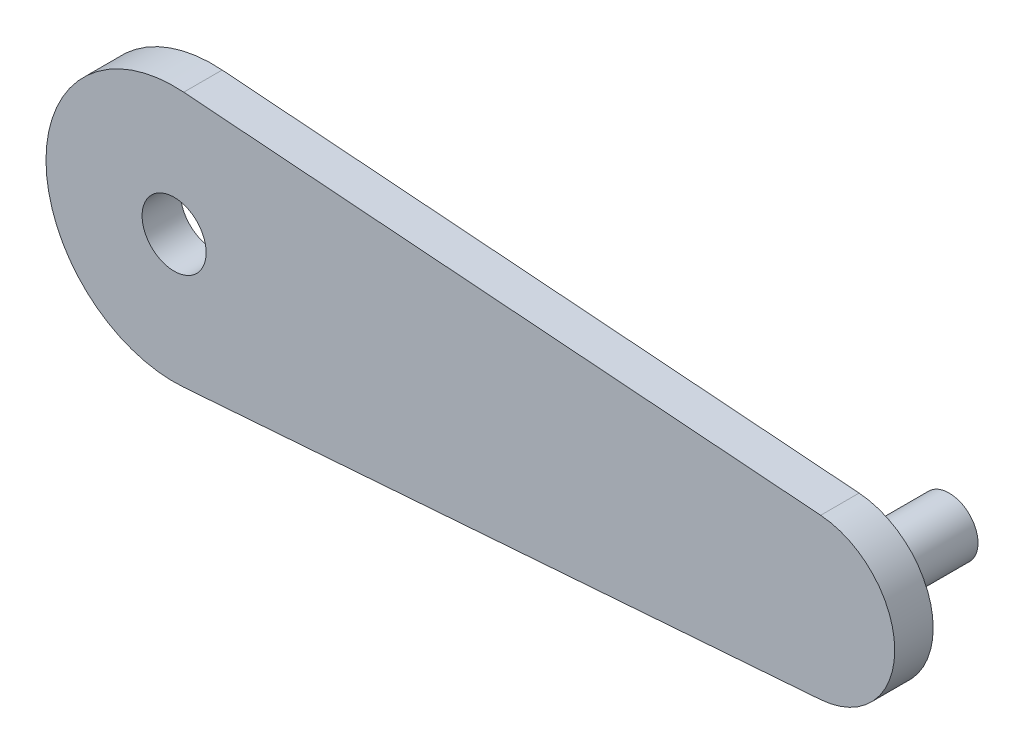
ISO-10303-21;
HEADER;
FILE_DESCRIPTION(('STEP AP214'),'2;1');
FILE_NAME('part.step','',(''),(''),'','','');
FILE_SCHEMA(('AUTOMOTIVE_DESIGN { 1 0 10303 214 1 1 1 1 }'));
ENDSEC;
DATA;
#1=APPLICATION_CONTEXT('core data for automotive mechanical design processes');
#2=APPLICATION_PROTOCOL_DEFINITION('international standard','automotive_design',2000,#1);
#3=PRODUCT_CONTEXT('',#1,'mechanical');
#4=PRODUCT('Part','Part','',(#3));
#5=PRODUCT_RELATED_PRODUCT_CATEGORY('part','',(#4));
#6=PRODUCT_DEFINITION_FORMATION('','',#4);
#7=PRODUCT_DEFINITION_CONTEXT('part definition',#1,'design');
#8=PRODUCT_DEFINITION('design','',#6,#7);
#9=PRODUCT_DEFINITION_SHAPE('','',#8);
#10=(LENGTH_UNIT() NAMED_UNIT(*) SI_UNIT(.MILLI.,.METRE.));
#11=(NAMED_UNIT(*) PLANE_ANGLE_UNIT() SI_UNIT($,.RADIAN.));
#12=(NAMED_UNIT(*) SI_UNIT($,.STERADIAN.) SOLID_ANGLE_UNIT());
#13=UNCERTAINTY_MEASURE_WITH_UNIT(LENGTH_MEASURE(1.E-05),#10,'distance_accuracy_value','');
#14=(GEOMETRIC_REPRESENTATION_CONTEXT(3) GLOBAL_UNCERTAINTY_ASSIGNED_CONTEXT((#13)) GLOBAL_UNIT_ASSIGNED_CONTEXT((#10,
#11,#12)) REPRESENTATION_CONTEXT('',''));
#15=CARTESIAN_POINT('',(0.,0.,0.));
#16=DIRECTION('',(0.,0.,1.));
#17=DIRECTION('',(1.,0.,0.));
#18=AXIS2_PLACEMENT_3D('',#15,#16,#17);
#19=CARTESIAN_POINT('',(0.,0.,1.2));
#20=DIRECTION('',(0.,0.,1.));
#21=DIRECTION('',(1.,0.,0.));
#22=AXIS2_PLACEMENT_3D('',#19,#20,#21);
#23=PLANE('',#22);
#24=DIRECTION('',(0.997183533758957,-0.0750000000000001,0.));
#25=VECTOR('',#24,1.);
#26=CARTESIAN_POINT('',(0.3,3.98873413503583,1.2));
#27=LINE('',#26,#25);
#28=CARTESIAN_POINT('',(0.3,3.98873413503583,1.2));
#29=VERTEX_POINT('',#28);
#30=CARTESIAN_POINT('',(20.1875,2.49295883439739,1.2));
#31=VERTEX_POINT('',#30);
#32=EDGE_CURVE('E106',#29,#31,#27,.T.);
#33=ORIENTED_EDGE('',*,*,#32,.F.);
#34=CARTESIAN_POINT('',(0.,0.,1.2));
#35=DIRECTION('',(0.,0.,1.));
#36=DIRECTION('',(1.,0.,0.));
#37=AXIS2_PLACEMENT_3D('',#34,#35,#36);
#38=CIRCLE('',#37,4.);
#39=CARTESIAN_POINT('',(0.3,-3.98873413503582,1.2));
#40=VERTEX_POINT('',#39);
#41=EDGE_CURVE('E100',#29,#40,#38,.T.);
#42=ORIENTED_EDGE('',*,*,#41,.T.);
#43=DIRECTION('',(-0.997183533758957,-0.075,0.));
#44=VECTOR('',#43,1.);
#45=CARTESIAN_POINT('',(0.3,-3.98873413503582,1.2));
#46=LINE('',#45,#44);
#47=CARTESIAN_POINT('',(20.1875,-2.49295883439739,1.2));
#48=VERTEX_POINT('',#47);
#49=EDGE_CURVE('E105',#48,#40,#46,.T.);
#50=ORIENTED_EDGE('',*,*,#49,.F.);
#51=CARTESIAN_POINT('',(20.,0.,1.2));
#52=DIRECTION('',(0.,0.,1.));
#53=DIRECTION('',(1.,0.,0.));
#54=AXIS2_PLACEMENT_3D('',#51,#52,#53);
#55=CIRCLE('',#54,2.5);
#56=EDGE_CURVE('E119',#31,#48,#55,.F.);
#57=ORIENTED_EDGE('',*,*,#56,.F.);
#58=EDGE_LOOP('',(#33,#42,#50,#57));
#59=FACE_BOUND('',#58,.T.);
#60=CARTESIAN_POINT('',(0.,0.,1.2));
#61=DIRECTION('',(0.,0.,1.));
#62=DIRECTION('',(1.,0.,0.));
#63=AXIS2_PLACEMENT_3D('',#60,#61,#62);
#64=CIRCLE('',#63,1.);
#65=CARTESIAN_POINT('',(1.,0.,1.2));
#66=VERTEX_POINT('',#65);
#67=EDGE_CURVE('E128',#66,#66,#64,.T.);
#68=ORIENTED_EDGE('',*,*,#67,.F.);
#69=EDGE_LOOP('',(#68));
#70=FACE_BOUND('',#69,.T.);
#71=ADVANCED_FACE('F56',(#59,#70),#23,.T.);
#72=CARTESIAN_POINT('',(0.,0.,0.));
#73=DIRECTION('',(0.,0.,1.));
#74=DIRECTION('',(1.,0.,0.));
#75=AXIS2_PLACEMENT_3D('',#72,#73,#74);
#76=PLANE('',#75);
#77=CARTESIAN_POINT('',(20.,0.,0.));
#78=DIRECTION('',(0.,0.,1.));
#79=DIRECTION('',(1.,0.,0.));
#80=AXIS2_PLACEMENT_3D('',#77,#78,#79);
#81=CIRCLE('',#80,0.9);
#82=CARTESIAN_POINT('',(20.9,0.,0.));
#83=VERTEX_POINT('',#82);
#84=EDGE_CURVE('E152',#83,#83,#81,.T.);
#85=ORIENTED_EDGE('',*,*,#84,.T.);
#86=EDGE_LOOP('',(#85));
#87=FACE_BOUND('',#86,.T.);
#88=DIRECTION('',(0.997183533758957,-0.0750000000000001,0.));
#89=VECTOR('',#88,1.);
#90=CARTESIAN_POINT('',(0.3,3.98873413503583,0.));
#91=LINE('',#90,#89);
#92=CARTESIAN_POINT('',(0.3,3.98873413503583,0.));
#93=VERTEX_POINT('',#92);
#94=CARTESIAN_POINT('',(20.1875,2.49295883439739,0.));
#95=VERTEX_POINT('',#94);
#96=EDGE_CURVE('E125',#93,#95,#91,.T.);
#97=ORIENTED_EDGE('',*,*,#96,.T.);
#98=CARTESIAN_POINT('',(20.,0.,0.));
#99=DIRECTION('',(0.,0.,1.));
#100=DIRECTION('',(1.,0.,0.));
#101=AXIS2_PLACEMENT_3D('',#98,#99,#100);
#102=CIRCLE('',#101,2.5);
#103=CARTESIAN_POINT('',(20.1875,-2.49295883439739,0.));
#104=VERTEX_POINT('',#103);
#105=EDGE_CURVE('E134',#95,#104,#102,.F.);
#106=ORIENTED_EDGE('',*,*,#105,.T.);
#107=DIRECTION('',(-0.997183533758957,-0.075,0.));
#108=VECTOR('',#107,1.);
#109=CARTESIAN_POINT('',(0.3,-3.98873413503582,0.));
#110=LINE('',#109,#108);
#111=CARTESIAN_POINT('',(0.3,-3.98873413503582,0.));
#112=VERTEX_POINT('',#111);
#113=EDGE_CURVE('E131',#104,#112,#110,.T.);
#114=ORIENTED_EDGE('',*,*,#113,.T.);
#115=CARTESIAN_POINT('',(0.,0.,0.));
#116=DIRECTION('',(0.,0.,1.));
#117=DIRECTION('',(1.,0.,0.));
#118=AXIS2_PLACEMENT_3D('',#115,#116,#117);
#119=CIRCLE('',#118,4.);
#120=EDGE_CURVE('E113',#93,#112,#119,.T.);
#121=ORIENTED_EDGE('',*,*,#120,.F.);
#122=EDGE_LOOP('',(#97,#106,#114,#121));
#123=FACE_BOUND('',#122,.T.);
#124=CARTESIAN_POINT('',(0.,0.,0.));
#125=DIRECTION('',(0.,0.,1.));
#126=DIRECTION('',(1.,0.,0.));
#127=AXIS2_PLACEMENT_3D('',#124,#125,#126);
#128=CIRCLE('',#127,1.);
#129=CARTESIAN_POINT('',(1.,0.,0.));
#130=VERTEX_POINT('',#129);
#131=EDGE_CURVE('E144',#130,#130,#128,.T.);
#132=ORIENTED_EDGE('',*,*,#131,.T.);
#133=EDGE_LOOP('',(#132));
#134=FACE_BOUND('',#133,.T.);
#135=ADVANCED_FACE('F172',(#87,#123,#134),#76,.F.);
#136=CARTESIAN_POINT('',(0.3,3.98873413503583,1.2));
#137=DIRECTION('',(0.0750000000000001,0.997183533758956,0.));
#138=DIRECTION('',(-0.997183533758957,0.0750000000000001,0.));
#139=AXIS2_PLACEMENT_3D('',#136,#137,#138);
#140=PLANE('',#139);
#141=ORIENTED_EDGE('',*,*,#96,.F.);
#142=DIRECTION('',(0.,0.,-1.));
#143=VECTOR('',#142,1.);
#144=CARTESIAN_POINT('',(0.3,3.98873413503583,1.2));
#145=LINE('',#144,#143);
#146=EDGE_CURVE('E12',#29,#93,#145,.T.);
#147=ORIENTED_EDGE('',*,*,#146,.F.);
#148=ORIENTED_EDGE('',*,*,#32,.T.);
#149=DIRECTION('',(0.,0.,-1.));
#150=VECTOR('',#149,1.);
#151=CARTESIAN_POINT('',(20.1875,2.49295883439739,1.2));
#152=LINE('',#151,#150);
#153=EDGE_CURVE('E74',#31,#95,#152,.T.);
#154=ORIENTED_EDGE('',*,*,#153,.T.);
#155=EDGE_LOOP('',(#141,#147,#148,#154));
#156=FACE_BOUND('',#155,.T.);
#157=ADVANCED_FACE('F58',(#156),#140,.T.);
#158=CARTESIAN_POINT('',(0.,0.,1.2));
#159=DIRECTION('',(0.,0.,-1.));
#160=DIRECTION('',(-1.,0.,0.));
#161=AXIS2_PLACEMENT_3D('',#158,#159,#160);
#162=CYLINDRICAL_SURFACE('',#161,4.);
#163=ORIENTED_EDGE('',*,*,#120,.T.);
#164=DIRECTION('',(0.,0.,-1.));
#165=VECTOR('',#164,1.);
#166=CARTESIAN_POINT('',(0.3,-3.98873413503582,1.2));
#167=LINE('',#166,#165);
#168=EDGE_CURVE('E66',#40,#112,#167,.T.);
#169=ORIENTED_EDGE('',*,*,#168,.F.);
#170=ORIENTED_EDGE('',*,*,#41,.F.);
#171=ORIENTED_EDGE('',*,*,#146,.T.);
#172=EDGE_LOOP('',(#163,#169,#170,#171));
#173=FACE_BOUND('',#172,.T.);
#174=ADVANCED_FACE('F111',(#173),#162,.T.);
#175=CARTESIAN_POINT('',(0.3,-3.98873413503582,1.2));
#176=DIRECTION('',(0.075,-0.997183533758956,0.));
#177=DIRECTION('',(0.997183533758957,0.075,0.));
#178=AXIS2_PLACEMENT_3D('',#175,#176,#177);
#179=PLANE('',#178);
#180=ORIENTED_EDGE('',*,*,#113,.F.);
#181=DIRECTION('',(0.,0.,-1.));
#182=VECTOR('',#181,1.);
#183=CARTESIAN_POINT('',(20.1875,-2.49295883439739,1.2));
#184=LINE('',#183,#182);
#185=EDGE_CURVE('E87',#48,#104,#184,.T.);
#186=ORIENTED_EDGE('',*,*,#185,.F.);
#187=ORIENTED_EDGE('',*,*,#49,.T.);
#188=ORIENTED_EDGE('',*,*,#168,.T.);
#189=EDGE_LOOP('',(#180,#186,#187,#188));
#190=FACE_BOUND('',#189,.T.);
#191=ADVANCED_FACE('F117',(#190),#179,.T.);
#192=CARTESIAN_POINT('',(20.,0.,1.2));
#193=DIRECTION('',(0.,0.,-1.));
#194=DIRECTION('',(-1.,0.,0.));
#195=AXIS2_PLACEMENT_3D('',#192,#193,#194);
#196=CYLINDRICAL_SURFACE('',#195,2.5);
#197=ORIENTED_EDGE('',*,*,#105,.F.);
#198=ORIENTED_EDGE('',*,*,#153,.F.);
#199=ORIENTED_EDGE('',*,*,#56,.T.);
#200=ORIENTED_EDGE('',*,*,#185,.T.);
#201=EDGE_LOOP('',(#197,#198,#199,#200));
#202=FACE_BOUND('',#201,.T.);
#203=ADVANCED_FACE('F181',(#202),#196,.T.);
#204=CARTESIAN_POINT('',(0.,0.,1.2));
#205=DIRECTION('',(0.,0.,-1.));
#206=DIRECTION('',(-1.,0.,0.));
#207=AXIS2_PLACEMENT_3D('',#204,#205,#206);
#208=CYLINDRICAL_SURFACE('',#207,1.);
#209=ORIENTED_EDGE('',*,*,#67,.T.);
#210=EDGE_LOOP('',(#209));
#211=FACE_BOUND('',#210,.T.);
#212=ORIENTED_EDGE('',*,*,#131,.F.);
#213=EDGE_LOOP('',(#212));
#214=FACE_BOUND('',#213,.T.);
#215=ADVANCED_FACE('F169',(#211,#214),#208,.F.);
#216=CARTESIAN_POINT('',(20.,0.,-3.));
#217=DIRECTION('',(0.,0.,1.));
#218=DIRECTION('',(1.,0.,0.));
#219=AXIS2_PLACEMENT_3D('',#216,#217,#218);
#220=CYLINDRICAL_SURFACE('',#219,0.9);
#221=CARTESIAN_POINT('',(20.,0.,-3.));
#222=DIRECTION('',(0.,0.,1.));
#223=DIRECTION('',(1.,0.,0.));
#224=AXIS2_PLACEMENT_3D('',#221,#222,#223);
#225=CIRCLE('',#224,0.9);
#226=CARTESIAN_POINT('',(20.9,0.,-3.));
#227=VERTEX_POINT('',#226);
#228=EDGE_CURVE('E148',#227,#227,#225,.T.);
#229=ORIENTED_EDGE('',*,*,#228,.T.);
#230=EDGE_LOOP('',(#229));
#231=FACE_BOUND('',#230,.T.);
#232=ORIENTED_EDGE('',*,*,#84,.F.);
#233=EDGE_LOOP('',(#232));
#234=FACE_BOUND('',#233,.T.);
#235=ADVANCED_FACE('F160',(#231,#234),#220,.T.);
#236=CARTESIAN_POINT('',(0.,0.,-3.));
#237=DIRECTION('',(0.,0.,1.));
#238=DIRECTION('',(1.,0.,0.));
#239=AXIS2_PLACEMENT_3D('',#236,#237,#238);
#240=PLANE('',#239);
#241=ORIENTED_EDGE('',*,*,#228,.F.);
#242=EDGE_LOOP('',(#241));
#243=FACE_BOUND('',#242,.T.);
#244=ADVANCED_FACE('F163',(#243),#240,.F.);
#245=CLOSED_SHELL('',(#71,#135,#157,#174,#191,#203,#215,#235,#244));
#246=MANIFOLD_SOLID_BREP('B2',#245);
#247=ADVANCED_BREP_SHAPE_REPRESENTATION('',(#18,#246),#14);
#248=SHAPE_DEFINITION_REPRESENTATION(#9,#247);
ENDSEC;
END-ISO-10303-21;
